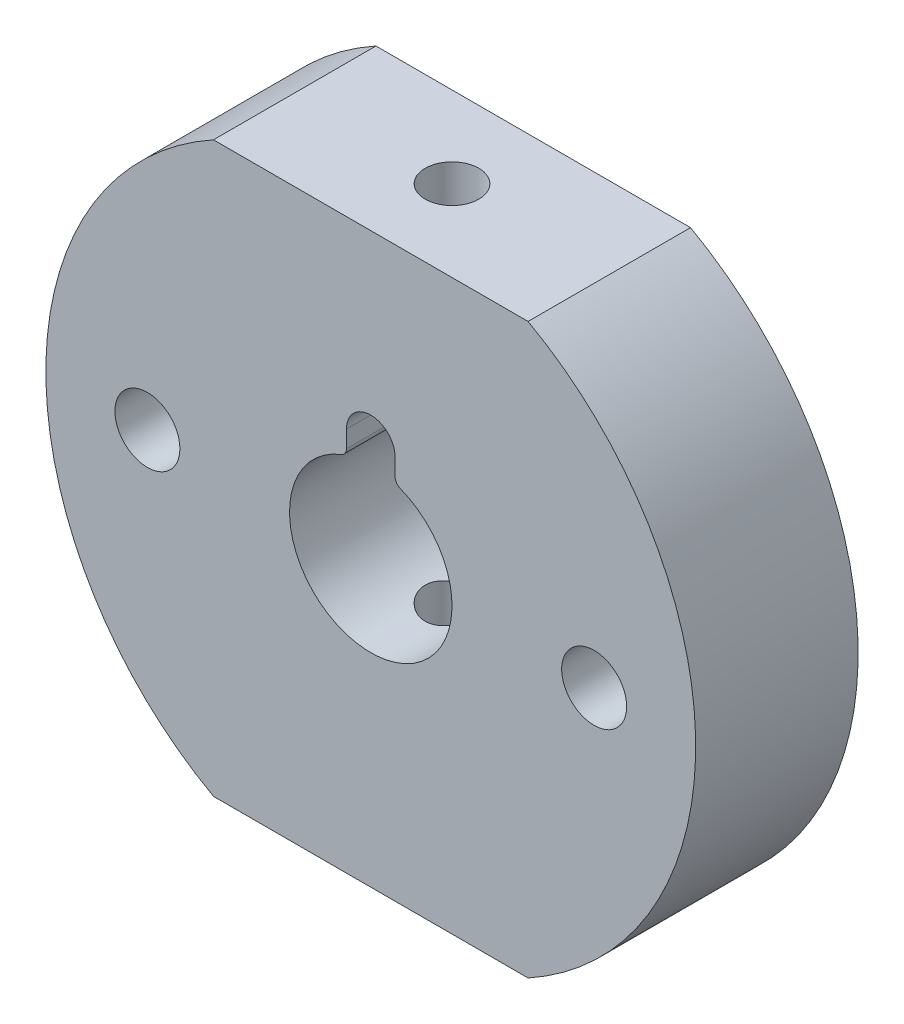
ISO-10303-21;
HEADER;
FILE_DESCRIPTION(('STEP AP214'),'2;1');
FILE_NAME('part.step','',(''),(''),'','','');
FILE_SCHEMA(('AUTOMOTIVE_DESIGN { 1 0 10303 214 1 1 1 1 }'));
ENDSEC;
DATA;
#1=APPLICATION_CONTEXT('core data for automotive mechanical design processes');
#2=APPLICATION_PROTOCOL_DEFINITION('international standard','automotive_design',2000,#1);
#3=PRODUCT_CONTEXT('',#1,'mechanical');
#4=PRODUCT('Part','Part','',(#3));
#5=PRODUCT_RELATED_PRODUCT_CATEGORY('part','',(#4));
#6=PRODUCT_DEFINITION_FORMATION('','',#4);
#7=PRODUCT_DEFINITION_CONTEXT('part definition',#1,'design');
#8=PRODUCT_DEFINITION('design','',#6,#7);
#9=PRODUCT_DEFINITION_SHAPE('','',#8);
#10=(LENGTH_UNIT() NAMED_UNIT(*) SI_UNIT(.MILLI.,.METRE.));
#11=(NAMED_UNIT(*) PLANE_ANGLE_UNIT() SI_UNIT($,.RADIAN.));
#12=(NAMED_UNIT(*) SI_UNIT($,.STERADIAN.) SOLID_ANGLE_UNIT());
#13=UNCERTAINTY_MEASURE_WITH_UNIT(LENGTH_MEASURE(1.E-05),#10,'distance_accuracy_value','');
#14=(GEOMETRIC_REPRESENTATION_CONTEXT(3) GLOBAL_UNCERTAINTY_ASSIGNED_CONTEXT((#13)) GLOBAL_UNIT_ASSIGNED_CONTEXT((#10,
#11,#12)) REPRESENTATION_CONTEXT('',''));
#15=CARTESIAN_POINT('',(0.,0.,0.));
#16=DIRECTION('',(0.,0.,1.));
#17=DIRECTION('',(1.,0.,0.));
#18=AXIS2_PLACEMENT_3D('',#15,#16,#17);
#19=CARTESIAN_POINT('',(0.,0.,10.));
#20=DIRECTION('',(0.,0.,1.));
#21=DIRECTION('',(1.,0.,0.));
#22=AXIS2_PLACEMENT_3D('',#19,#20,#21);
#23=PLANE('',#22);
#24=DIRECTION('',(1.,0.,0.));
#25=VECTOR('',#24,1.);
#26=CARTESIAN_POINT('',(0.,17.5,10.));
#27=LINE('',#26,#25);
#28=CARTESIAN_POINT('',(-9.68245836551854,17.5,10.));
#29=VERTEX_POINT('',#28);
#30=CARTESIAN_POINT('',(9.68245836551855,17.5,10.));
#31=VERTEX_POINT('',#30);
#32=EDGE_CURVE('E148',#29,#31,#27,.T.);
#33=ORIENTED_EDGE('',*,*,#32,.F.);
#34=CARTESIAN_POINT('',(0.,0.,10.));
#35=DIRECTION('',(0.,0.,1.));
#36=DIRECTION('',(1.,0.,0.));
#37=AXIS2_PLACEMENT_3D('',#34,#35,#36);
#38=CIRCLE('',#37,20.);
#39=CARTESIAN_POINT('',(-9.68245836551854,-17.5,10.));
#40=VERTEX_POINT('',#39);
#41=EDGE_CURVE('E157',#29,#40,#38,.T.);
#42=ORIENTED_EDGE('',*,*,#41,.T.);
#43=DIRECTION('',(1.,0.,0.));
#44=VECTOR('',#43,1.);
#45=CARTESIAN_POINT('',(0.,-17.5,10.));
#46=LINE('',#45,#44);
#47=CARTESIAN_POINT('',(9.68245836551855,-17.5,10.));
#48=VERTEX_POINT('',#47);
#49=EDGE_CURVE('E272',#40,#48,#46,.T.);
#50=ORIENTED_EDGE('',*,*,#49,.T.);
#51=EDGE_CURVE('E162',#48,#31,#38,.T.);
#52=ORIENTED_EDGE('',*,*,#51,.T.);
#53=EDGE_LOOP('',(#33,#42,#50,#52));
#54=FACE_BOUND('',#53,.T.);
#55=DIRECTION('',(0.,1.,0.));
#56=VECTOR('',#55,1.);
#57=CARTESIAN_POINT('',(1.5,0.,10.));
#58=LINE('',#57,#56);
#59=CARTESIAN_POINT('',(1.5,5.1234753829798,10.));
#60=VERTEX_POINT('',#59);
#61=CARTESIAN_POINT('',(1.5,6.16969600708473,10.));
#62=VERTEX_POINT('',#61);
#63=EDGE_CURVE('E284',#60,#62,#58,.T.);
#64=ORIENTED_EDGE('',*,*,#63,.F.);
#65=CARTESIAN_POINT('',(2.,5.1234753829798,10.));
#66=DIRECTION('',(0.,0.,1.));
#67=DIRECTION('',(1.,0.,0.));
#68=AXIS2_PLACEMENT_3D('',#65,#66,#67);
#69=CIRCLE('',#68,0.5);
#70=CARTESIAN_POINT('',(1.81818181818182,4.657704893618,10.));
#71=VERTEX_POINT('',#70);
#72=EDGE_CURVE('E349',#60,#71,#69,.T.);
#73=ORIENTED_EDGE('',*,*,#72,.T.);
#74=CARTESIAN_POINT('',(0.,0.,10.));
#75=DIRECTION('',(0.,0.,1.));
#76=DIRECTION('',(1.,0.,0.));
#77=AXIS2_PLACEMENT_3D('',#74,#75,#76);
#78=CIRCLE('',#77,5.);
#79=CARTESIAN_POINT('',(-1.81818181818182,4.657704893618,10.));
#80=VERTEX_POINT('',#79);
#81=EDGE_CURVE('E167',#80,#71,#78,.T.);
#82=ORIENTED_EDGE('',*,*,#81,.F.);
#83=CARTESIAN_POINT('',(-2.,5.1234753829798,10.));
#84=DIRECTION('',(0.,0.,1.));
#85=DIRECTION('',(1.,0.,0.));
#86=AXIS2_PLACEMENT_3D('',#83,#84,#85);
#87=CIRCLE('',#86,0.5);
#88=CARTESIAN_POINT('',(-1.5,5.1234753829798,10.));
#89=VERTEX_POINT('',#88);
#90=EDGE_CURVE('E350',#80,#89,#87,.T.);
#91=ORIENTED_EDGE('',*,*,#90,.T.);
#92=DIRECTION('',(0.,1.,0.));
#93=VECTOR('',#92,1.);
#94=CARTESIAN_POINT('',(-1.5,0.,10.));
#95=LINE('',#94,#93);
#96=CARTESIAN_POINT('',(-1.5,6.16969600708473,10.));
#97=VERTEX_POINT('',#96);
#98=EDGE_CURVE('E278',#89,#97,#95,.T.);
#99=ORIENTED_EDGE('',*,*,#98,.T.);
#100=CARTESIAN_POINT('',(0.,6.16969600708473,10.));
#101=DIRECTION('',(0.,0.,1.));
#102=DIRECTION('',(1.,0.,0.));
#103=AXIS2_PLACEMENT_3D('',#100,#101,#102);
#104=CIRCLE('',#103,1.5);
#105=EDGE_CURVE('E286',#62,#97,#104,.T.);
#106=ORIENTED_EDGE('',*,*,#105,.F.);
#107=EDGE_LOOP('',(#64,#73,#82,#91,#99,#106));
#108=FACE_BOUND('',#107,.T.);
#109=CARTESIAN_POINT('',(-13.75,0.,10.));
#110=DIRECTION('',(0.,0.,1.));
#111=DIRECTION('',(1.,0.,0.));
#112=AXIS2_PLACEMENT_3D('',#109,#110,#111);
#113=CIRCLE('',#112,2.);
#114=CARTESIAN_POINT('',(-11.75,0.,10.));
#115=VERTEX_POINT('',#114);
#116=EDGE_CURVE('E302',#115,#115,#113,.T.);
#117=ORIENTED_EDGE('',*,*,#116,.F.);
#118=EDGE_LOOP('',(#117));
#119=FACE_BOUND('',#118,.T.);
#120=CARTESIAN_POINT('',(13.75,0.,10.));
#121=DIRECTION('',(0.,0.,1.));
#122=DIRECTION('',(1.,0.,0.));
#123=AXIS2_PLACEMENT_3D('',#120,#121,#122);
#124=CIRCLE('',#123,2.);
#125=CARTESIAN_POINT('',(15.75,0.,10.));
#126=VERTEX_POINT('',#125);
#127=EDGE_CURVE('E296',#126,#126,#124,.T.);
#128=ORIENTED_EDGE('',*,*,#127,.F.);
#129=EDGE_LOOP('',(#128));
#130=FACE_BOUND('',#129,.T.);
#131=ADVANCED_FACE('F35',(#54,#108,#119,#130),#23,.T.);
#132=CARTESIAN_POINT('',(0.,0.,0.));
#133=DIRECTION('',(0.,0.,1.));
#134=DIRECTION('',(1.,0.,0.));
#135=AXIS2_PLACEMENT_3D('',#132,#133,#134);
#136=PLANE('',#135);
#137=CARTESIAN_POINT('',(13.75,0.,0.));
#138=DIRECTION('',(0.,0.,1.));
#139=DIRECTION('',(1.,0.,0.));
#140=AXIS2_PLACEMENT_3D('',#137,#138,#139);
#141=CIRCLE('',#140,2.);
#142=CARTESIAN_POINT('',(15.75,0.,0.));
#143=VERTEX_POINT('',#142);
#144=EDGE_CURVE('E178',#143,#143,#141,.T.);
#145=ORIENTED_EDGE('',*,*,#144,.T.);
#146=EDGE_LOOP('',(#145));
#147=FACE_BOUND('',#146,.T.);
#148=CARTESIAN_POINT('',(-13.75,0.,0.));
#149=DIRECTION('',(0.,0.,1.));
#150=DIRECTION('',(1.,0.,0.));
#151=AXIS2_PLACEMENT_3D('',#148,#149,#150);
#152=CIRCLE('',#151,2.);
#153=CARTESIAN_POINT('',(-11.75,0.,0.));
#154=VERTEX_POINT('',#153);
#155=EDGE_CURVE('E299',#154,#154,#152,.T.);
#156=ORIENTED_EDGE('',*,*,#155,.T.);
#157=EDGE_LOOP('',(#156));
#158=FACE_BOUND('',#157,.T.);
#159=CARTESIAN_POINT('',(0.,0.,0.));
#160=DIRECTION('',(0.,0.,1.));
#161=DIRECTION('',(1.,0.,0.));
#162=AXIS2_PLACEMENT_3D('',#159,#160,#161);
#163=CIRCLE('',#162,5.);
#164=CARTESIAN_POINT('',(-1.81818181818182,4.657704893618,0.));
#165=VERTEX_POINT('',#164);
#166=CARTESIAN_POINT('',(1.81818181818182,4.657704893618,0.));
#167=VERTEX_POINT('',#166);
#168=EDGE_CURVE('E305',#165,#167,#163,.T.);
#169=ORIENTED_EDGE('',*,*,#168,.T.);
#170=CARTESIAN_POINT('',(2.,5.1234753829798,0.));
#171=DIRECTION('',(0.,0.,1.));
#172=DIRECTION('',(1.,0.,0.));
#173=AXIS2_PLACEMENT_3D('',#170,#171,#172);
#174=CIRCLE('',#173,0.5);
#175=CARTESIAN_POINT('',(1.5,5.1234753829798,0.));
#176=VERTEX_POINT('',#175);
#177=EDGE_CURVE('E313',#167,#176,#174,.F.);
#178=ORIENTED_EDGE('',*,*,#177,.T.);
#179=DIRECTION('',(0.,1.,0.));
#180=VECTOR('',#179,1.);
#181=CARTESIAN_POINT('',(1.5,0.,0.));
#182=LINE('',#181,#180);
#183=CARTESIAN_POINT('',(1.5,6.16969600708473,0.));
#184=VERTEX_POINT('',#183);
#185=EDGE_CURVE('E275',#176,#184,#182,.T.);
#186=ORIENTED_EDGE('',*,*,#185,.T.);
#187=CARTESIAN_POINT('',(0.,6.16969600708473,0.));
#188=DIRECTION('',(0.,0.,1.));
#189=DIRECTION('',(1.,0.,0.));
#190=AXIS2_PLACEMENT_3D('',#187,#188,#189);
#191=CIRCLE('',#190,1.5);
#192=CARTESIAN_POINT('',(-1.5,6.16969600708473,0.));
#193=VERTEX_POINT('',#192);
#194=EDGE_CURVE('E277',#184,#193,#191,.T.);
#195=ORIENTED_EDGE('',*,*,#194,.T.);
#196=DIRECTION('',(0.,1.,0.));
#197=VECTOR('',#196,1.);
#198=CARTESIAN_POINT('',(-1.5,0.,0.));
#199=LINE('',#198,#197);
#200=CARTESIAN_POINT('',(-1.5,5.1234753829798,0.));
#201=VERTEX_POINT('',#200);
#202=EDGE_CURVE('E281',#201,#193,#199,.T.);
#203=ORIENTED_EDGE('',*,*,#202,.F.);
#204=CARTESIAN_POINT('',(-2.,5.1234753829798,0.));
#205=DIRECTION('',(0.,0.,1.));
#206=DIRECTION('',(1.,0.,0.));
#207=AXIS2_PLACEMENT_3D('',#204,#205,#206);
#208=CIRCLE('',#207,0.5);
#209=EDGE_CURVE('E317',#201,#165,#208,.F.);
#210=ORIENTED_EDGE('',*,*,#209,.T.);
#211=EDGE_LOOP('',(#169,#178,#186,#195,#203,#210));
#212=FACE_BOUND('',#211,.T.);
#213=CARTESIAN_POINT('',(0.,0.,0.));
#214=DIRECTION('',(0.,0.,1.));
#215=DIRECTION('',(1.,0.,0.));
#216=AXIS2_PLACEMENT_3D('',#213,#214,#215);
#217=CIRCLE('',#216,20.);
#218=CARTESIAN_POINT('',(-9.68245836551854,17.5,0.));
#219=VERTEX_POINT('',#218);
#220=CARTESIAN_POINT('',(-9.68245836551854,-17.5,0.));
#221=VERTEX_POINT('',#220);
#222=EDGE_CURVE('E155',#219,#221,#217,.T.);
#223=ORIENTED_EDGE('',*,*,#222,.F.);
#224=DIRECTION('',(1.,0.,0.));
#225=VECTOR('',#224,1.);
#226=CARTESIAN_POINT('',(0.,17.5,0.));
#227=LINE('',#226,#225);
#228=CARTESIAN_POINT('',(9.68245836551855,17.5,0.));
#229=VERTEX_POINT('',#228);
#230=EDGE_CURVE('E136',#219,#229,#227,.T.);
#231=ORIENTED_EDGE('',*,*,#230,.T.);
#232=CARTESIAN_POINT('',(9.68245836551855,-17.5,0.));
#233=VERTEX_POINT('',#232);
#234=EDGE_CURVE('E163',#233,#229,#217,.T.);
#235=ORIENTED_EDGE('',*,*,#234,.F.);
#236=DIRECTION('',(1.,0.,0.));
#237=VECTOR('',#236,1.);
#238=CARTESIAN_POINT('',(0.,-17.5,0.));
#239=LINE('',#238,#237);
#240=EDGE_CURVE('E161',#221,#233,#239,.T.);
#241=ORIENTED_EDGE('',*,*,#240,.F.);
#242=EDGE_LOOP('',(#223,#231,#235,#241));
#243=FACE_BOUND('',#242,.T.);
#244=ADVANCED_FACE('F160',(#147,#158,#212,#243),#136,.F.);
#245=CARTESIAN_POINT('',(0.,0.,10.));
#246=DIRECTION('',(0.,0.,-1.));
#247=DIRECTION('',(-1.,0.,0.));
#248=AXIS2_PLACEMENT_3D('',#245,#246,#247);
#249=CYLINDRICAL_SURFACE('',#248,20.);
#250=ORIENTED_EDGE('',*,*,#41,.F.);
#251=DIRECTION('',(0.,0.,1.));
#252=VECTOR('',#251,1.);
#253=CARTESIAN_POINT('',(-9.68245836551854,17.5,0.));
#254=LINE('',#253,#252);
#255=EDGE_CURVE('E140',#219,#29,#254,.T.);
#256=ORIENTED_EDGE('',*,*,#255,.F.);
#257=ORIENTED_EDGE('',*,*,#222,.T.);
#258=DIRECTION('',(0.,0.,1.));
#259=VECTOR('',#258,1.);
#260=CARTESIAN_POINT('',(-9.68245836551854,-17.5,0.));
#261=LINE('',#260,#259);
#262=EDGE_CURVE('E267',#221,#40,#261,.T.);
#263=ORIENTED_EDGE('',*,*,#262,.T.);
#264=EDGE_LOOP('',(#250,#256,#257,#263));
#265=FACE_BOUND('',#264,.T.);
#266=ADVANCED_FACE('F153',(#265),#249,.T.);
#267=ORIENTED_EDGE('',*,*,#234,.T.);
#268=DIRECTION('',(0.,0.,1.));
#269=VECTOR('',#268,1.);
#270=CARTESIAN_POINT('',(9.68245836551855,17.5,0.));
#271=LINE('',#270,#269);
#272=EDGE_CURVE('E143',#229,#31,#271,.T.);
#273=ORIENTED_EDGE('',*,*,#272,.T.);
#274=ORIENTED_EDGE('',*,*,#51,.F.);
#275=DIRECTION('',(0.,0.,1.));
#276=VECTOR('',#275,1.);
#277=CARTESIAN_POINT('',(9.68245836551855,-17.5,0.));
#278=LINE('',#277,#276);
#279=EDGE_CURVE('E265',#233,#48,#278,.T.);
#280=ORIENTED_EDGE('',*,*,#279,.F.);
#281=EDGE_LOOP('',(#267,#273,#274,#280));
#282=FACE_BOUND('',#281,.T.);
#283=ADVANCED_FACE('F196',(#282),#249,.T.);
#284=CARTESIAN_POINT('',(0.,-20.,5.));
#285=DIRECTION('',(0.,1.,0.));
#286=DIRECTION('',(0.,0.,1.));
#287=AXIS2_PLACEMENT_3D('',#284,#285,#286);
#288=CYLINDRICAL_SURFACE('',#287,1.65);
#289=CARTESIAN_POINT('',(0.,-5.,6.65));
#290=CARTESIAN_POINT('',(0.0900803323989869,-5.00000012564882,6.65000024251439));
#291=CARTESIAN_POINT('',(0.180159574077353,-4.99754312617873,6.64259916251505));
#292=CARTESIAN_POINT('',(0.357667875169258,-4.98798348171152,6.61327885047237));
#293=CARTESIAN_POINT('',(0.445096605656321,-4.98088026257134,6.59135782416472));
#294=CARTESIAN_POINT('',(0.614719075952395,-4.962800681432,6.53382868761172));
#295=CARTESIAN_POINT('',(0.696921201899967,-4.95183071876684,6.49824318298597));
#296=CARTESIAN_POINT('',(0.854190645874484,-4.92713947248839,6.41449642730815));
#297=CARTESIAN_POINT('',(0.929256597076055,-4.91341766335966,6.36633277369658));
#298=CARTESIAN_POINT('',(1.07267700256014,-4.88414667976014,6.25707517692859));
#299=CARTESIAN_POINT('',(1.140755021368,-4.86855436886587,6.19562998172584));
#300=CARTESIAN_POINT('',(1.26585047260417,-4.83753907804007,6.06230048608017));
#301=CARTESIAN_POINT('',(1.32286553369749,-4.8221161350793,5.99041395330729));
#302=CARTESIAN_POINT('',(1.42578155512387,-4.79271313173333,5.83576938762055));
#303=CARTESIAN_POINT('',(1.47132547146369,-4.77878574898835,5.75276276241484));
#304=CARTESIAN_POINT('',(1.54768950007051,-4.75460549483772,5.57973436916592));
#305=CARTESIAN_POINT('',(1.57851400356116,-4.74435152777496,5.48971470264767));
#306=CARTESIAN_POINT('',(1.62353134991424,-4.72913282635101,5.30835517091874));
#307=CARTESIAN_POINT('',(1.6382413417332,-4.72400412235766,5.21715783667435));
#308=CARTESIAN_POINT('',(1.65222861163856,-4.7191313464795,5.03345638730599));
#309=CARTESIAN_POINT('',(1.65151054662635,-4.71938564975367,4.94095267493226));
#310=CARTESIAN_POINT('',(1.63506410098719,-4.72510629107568,4.76165279760769));
#311=CARTESIAN_POINT('',(1.62000769651633,-4.73033928879681,4.67478626476119));
#312=CARTESIAN_POINT('',(1.57640708934977,-4.74504632523487,4.50488909383327));
#313=CARTESIAN_POINT('',(1.54786130181506,-4.75452086227438,4.42185890773474));
#314=CARTESIAN_POINT('',(1.47764674240873,-4.77681173941,4.26045256000536));
#315=CARTESIAN_POINT('',(1.43577693123636,-4.78967871947683,4.18217114977468));
#316=CARTESIAN_POINT('',(1.34024242388315,-4.81728315916032,4.03353163769848));
#317=CARTESIAN_POINT('',(1.28657437554158,-4.8320211498719,3.96317579630594));
#318=CARTESIAN_POINT('',(1.16572801734404,-4.86262798242566,3.82860477258979));
#319=CARTESIAN_POINT('',(1.09799945388895,-4.87851612594017,3.76488712135686));
#320=CARTESIAN_POINT('',(0.952622363558089,-4.9089733458653,3.6495858217608));
#321=CARTESIAN_POINT('',(0.874972923819722,-4.92354230068063,3.59800329124501));
#322=CARTESIAN_POINT('',(0.710918878360197,-4.94990429259939,3.50804648316298));
#323=CARTESIAN_POINT('',(0.624437715003009,-4.96166947936115,3.46980310278695));
#324=CARTESIAN_POINT('',(0.445788820584338,-4.98089634514734,3.4085602803937));
#325=CARTESIAN_POINT('',(0.353623035566636,-4.98835948795835,3.38555565293587));
#326=CARTESIAN_POINT('',(0.170434936942811,-4.99790001929539,3.35631921461674));
#327=CARTESIAN_POINT('',(0.0795310449403325,-5.00019320840939,3.34941490636054));
#328=CARTESIAN_POINT('',(-0.10215299707419,-4.99978120399321,3.35066263269126));
#329=CARTESIAN_POINT('',(-0.19293316503069,-4.99707683523427,3.35881218286676));
#330=CARTESIAN_POINT('',(-0.369117276094977,-4.98711592890817,3.38940282618291));
#331=CARTESIAN_POINT('',(-0.454600657078434,-4.97999029806495,3.41143321001453));
#332=CARTESIAN_POINT('',(-0.620625393385988,-4.9620361021664,3.46864869151175));
#333=CARTESIAN_POINT('',(-0.701166119538833,-4.9512070668376,3.50383545988189));
#334=CARTESIAN_POINT('',(-0.857353583850657,-4.92659738190256,3.58738101955236));
#335=CARTESIAN_POINT('',(-0.93281853863681,-4.91274728599483,3.63605861476449));
#336=CARTESIAN_POINT('',(-1.07472879779133,-4.8836680633903,3.74482823479591));
#337=CARTESIAN_POINT('',(-1.14117138619964,-4.86843852373584,3.80492368367396));
#338=CARTESIAN_POINT('',(-1.26622547851877,-4.83745909847491,3.93798617269195));
#339=CARTESIAN_POINT('',(-1.32435715949936,-4.82171620160002,4.0114068669237));
#340=CARTESIAN_POINT('',(-1.42753142742357,-4.79218567046632,4.16729985489368));
#341=CARTESIAN_POINT('',(-1.47257396443646,-4.77839804366632,4.24977218315924));
#342=CARTESIAN_POINT('',(-1.54806908435208,-4.75447746870333,4.42142548395833));
#343=CARTESIAN_POINT('',(-1.57855621066785,-4.74433588191365,4.51058998597721));
#344=CARTESIAN_POINT('',(-1.62395003915296,-4.728992662468,4.69319790207959));
#345=CARTESIAN_POINT('',(-1.6388635764124,-4.72378886275909,4.78663942021202));
#346=CARTESIAN_POINT('',(-1.65216049477084,-4.71915352744857,4.97008542491291));
#347=CARTESIAN_POINT('',(-1.65133872365081,-4.71944442417866,5.06002593637817));
#348=CARTESIAN_POINT('',(-1.63513842564514,-4.72508139490563,5.23841659959015));
#349=CARTESIAN_POINT('',(-1.61976073262756,-4.73042717932209,5.32686683641512));
#350=CARTESIAN_POINT('',(-1.57544291875232,-4.74536693764461,5.49816413718459));
#351=CARTESIAN_POINT('',(-1.5467552709297,-4.75488165289364,5.58108397215747));
#352=CARTESIAN_POINT('',(-1.47683540940046,-4.77705935615133,5.74099749266258));
#353=CARTESIAN_POINT('',(-1.43560044678477,-4.78972303393433,5.81798987495191));
#354=CARTESIAN_POINT('',(-1.33969084183066,-4.81744939348764,5.96744345436639));
#355=CARTESIAN_POINT('',(-1.28451538865982,-4.83259170443489,6.03956841106977));
#356=CARTESIAN_POINT('',(-1.16314331347536,-4.86323043063064,6.17379258067502));
#357=CARTESIAN_POINT('',(-1.09694360376003,-4.87872694403302,6.23588897512674));
#358=CARTESIAN_POINT('',(-0.95238767673411,-4.90903317548773,6.35066333180926));
#359=CARTESIAN_POINT('',(-0.873665758138173,-4.92379458911327,6.40289502168525));
#360=CARTESIAN_POINT('',(-0.70807708205127,-4.95031750248797,6.49332485789776));
#361=CARTESIAN_POINT('',(-0.621212604024481,-4.96207983840249,6.53152691711137));
#362=CARTESIAN_POINT('',(-0.446386541872214,-4.98076953032462,6.59101301503053));
#363=CARTESIAN_POINT('',(-0.358709155083953,-4.98791371763214,6.61306352248398));
#364=CARTESIAN_POINT('',(-0.180687007883428,-4.99752827480817,6.6425549720432));
#365=CARTESIAN_POINT('',(-0.0903429553968477,-4.99999987398486,6.64999975677857));
#366=CARTESIAN_POINT('',(0.,-5.,6.65));
#367=B_SPLINE_CURVE_WITH_KNOTS('',3,(#289,#290,#291,#292,#293,#294,#295,#296,#297,#298,#299,
#300,#301,#302,#303,#304,#305,#306,#307,#308,#309,#310,#311,#312,#313,#314,#315,#316,#317,#318,
#319,#320,#321,#322,#323,#324,#325,#326,#327,#328,#329,#330,#331,#332,#333,#334,#335,#336,#337,
#338,#339,#340,#341,#342,#343,#344,#345,#346,#347,#348,#349,#350,#351,#352,#353,#354,#355,#356,
#357,#358,#359,#360,#361,#362,#363,#364,#365,#366),.UNSPECIFIED.,.T.,.F.,(4,2,2,2,2,2,2,2,2,2,2,
2,2,2,2,2,2,2,2,2,2,2,2,2,2,2,2,2,2,2,2,2,2,2,2,2,2,2,4),(0.,0.2699086041325,0.539850567737247,
0.809347867689094,1.07889668217443,1.35671215765951,1.63458711701568,1.92026489148117,
2.20585738673402,2.48198869358467,2.75803665240173,3.02175295330504,3.28550024538373,
3.55343249441287,3.82144096800204,4.10314526837295,4.38487550826387,4.66929734218009,
4.95362234329175,5.22584041060146,5.49801355645393,5.76248915124948,6.02699834271655,
6.29838751507405,6.56985820217368,6.85340472718154,7.13695233381086,7.41982362841787,
7.70257072144072,7.9710746862461,8.23956327014096,8.50315503612411,8.76680459233092,
9.04176838412562,9.31680931840238,9.60227659952698,9.88766420298746,10.1584309528124,
10.4291264568694),.UNSPECIFIED.);
#368=CARTESIAN_POINT('',(0.,-5.,6.65));
#369=VERTEX_POINT('',#368);
#370=EDGE_CURVE('E170',#369,#369,#367,.T.);
#371=ORIENTED_EDGE('',*,*,#370,.T.);
#372=EDGE_LOOP('',(#371));
#373=FACE_BOUND('',#372,.T.);
#374=CARTESIAN_POINT('',(0.,-17.5,5.));
#375=DIRECTION('',(0.,-1.,0.));
#376=DIRECTION('',(1.,0.,0.));
#377=AXIS2_PLACEMENT_3D('',#374,#375,#376);
#378=CIRCLE('',#377,1.65);
#379=CARTESIAN_POINT('',(1.65,-17.5,5.));
#380=VERTEX_POINT('',#379);
#381=EDGE_CURVE('E366',#380,#380,#378,.F.);
#382=ORIENTED_EDGE('',*,*,#381,.F.);
#383=EDGE_LOOP('',(#382));
#384=FACE_BOUND('',#383,.T.);
#385=ADVANCED_FACE('F191',(#373,#384),#288,.F.);
#386=CARTESIAN_POINT('',(0.,0.,10.));
#387=DIRECTION('',(0.,0.,-1.));
#388=DIRECTION('',(-1.,0.,0.));
#389=AXIS2_PLACEMENT_3D('',#386,#387,#388);
#390=CYLINDRICAL_SURFACE('',#389,5.);
#391=ORIENTED_EDGE('',*,*,#81,.T.);
#392=DIRECTION('',(0.,0.,-1.));
#393=VECTOR('',#392,1.);
#394=CARTESIAN_POINT('',(1.81818181818182,4.657704893618,10.));
#395=LINE('',#394,#393);
#396=EDGE_CURVE('E323',#71,#167,#395,.T.);
#397=ORIENTED_EDGE('',*,*,#396,.T.);
#398=ORIENTED_EDGE('',*,*,#168,.F.);
#399=DIRECTION('',(0.,0.,-1.));
#400=VECTOR('',#399,1.);
#401=CARTESIAN_POINT('',(-1.81818181818182,4.657704893618,10.));
#402=LINE('',#401,#400);
#403=EDGE_CURVE('E357',#165,#80,#402,.F.);
#404=ORIENTED_EDGE('',*,*,#403,.T.);
#405=EDGE_LOOP('',(#391,#397,#398,#404));
#406=FACE_BOUND('',#405,.T.);
#407=ORIENTED_EDGE('',*,*,#370,.F.);
#408=EDGE_LOOP('',(#407));
#409=FACE_BOUND('',#408,.T.);
#410=ADVANCED_FACE('F187',(#406,#409),#390,.F.);
#411=CARTESIAN_POINT('',(-13.75,0.,10.));
#412=DIRECTION('',(0.,0.,-1.));
#413=DIRECTION('',(-1.,0.,0.));
#414=AXIS2_PLACEMENT_3D('',#411,#412,#413);
#415=CYLINDRICAL_SURFACE('',#414,2.);
#416=ORIENTED_EDGE('',*,*,#116,.T.);
#417=EDGE_LOOP('',(#416));
#418=FACE_BOUND('',#417,.T.);
#419=ORIENTED_EDGE('',*,*,#155,.F.);
#420=EDGE_LOOP('',(#419));
#421=FACE_BOUND('',#420,.T.);
#422=ADVANCED_FACE('F378',(#418,#421),#415,.F.);
#423=CARTESIAN_POINT('',(13.75,0.,10.));
#424=DIRECTION('',(0.,0.,-1.));
#425=DIRECTION('',(-1.,0.,0.));
#426=AXIS2_PLACEMENT_3D('',#423,#424,#425);
#427=CYLINDRICAL_SURFACE('',#426,2.);
#428=ORIENTED_EDGE('',*,*,#127,.T.);
#429=EDGE_LOOP('',(#428));
#430=FACE_BOUND('',#429,.T.);
#431=ORIENTED_EDGE('',*,*,#144,.F.);
#432=EDGE_LOOP('',(#431));
#433=FACE_BOUND('',#432,.T.);
#434=ADVANCED_FACE('F200',(#430,#433),#427,.F.);
#435=CARTESIAN_POINT('',(0.,17.5,5.));
#436=DIRECTION('',(0.,-1.,0.));
#437=DIRECTION('',(1.,0.,0.));
#438=AXIS2_PLACEMENT_3D('',#435,#436,#437);
#439=CIRCLE('',#438,1.65);
#440=CARTESIAN_POINT('',(1.65,17.5,5.));
#441=VERTEX_POINT('',#440);
#442=EDGE_CURVE('E287',#441,#441,#439,.F.);
#443=ORIENTED_EDGE('',*,*,#442,.T.);
#444=EDGE_LOOP('',(#443));
#445=FACE_BOUND('',#444,.T.);
#446=DIRECTION('',(0.,1.,0.));
#447=VECTOR('',#446,1.);
#448=CARTESIAN_POINT('',(1.5,-20.,4.31261364575662));
#449=LINE('',#448,#447);
#450=CARTESIAN_POINT('',(1.5,6.16969600708473,4.31261364575662));
#451=VERTEX_POINT('',#450);
#452=CARTESIAN_POINT('',(1.5,5.1234753829798,4.31261364575662));
#453=VERTEX_POINT('',#452);
#454=EDGE_CURVE('E339',#451,#453,#449,.F.);
#455=ORIENTED_EDGE('',*,*,#454,.T.);
#456=CARTESIAN_POINT('',(1.5,5.1234753829798,4.31261364575662));
#457=CARTESIAN_POINT('',(1.49998522536645,5.11103341300865,4.31259073877459));
#458=CARTESIAN_POINT('',(1.50046373284753,5.09861881657721,4.31362536115257));
#459=CARTESIAN_POINT('',(1.50228314632314,5.07426248720778,4.31761201204794));
#460=CARTESIAN_POINT('',(1.50361726572787,5.06231781137854,4.3205489534572));
#461=CARTESIAN_POINT('',(1.50702311654809,5.03914226515855,4.32813890837247));
#462=CARTESIAN_POINT('',(1.50909307154573,5.02790975179097,4.33278778995941));
#463=CARTESIAN_POINT('',(1.51380278016137,5.00627944662721,4.34354281076478));
#464=CARTESIAN_POINT('',(1.51644367626189,4.9958833867007,4.34965187450916));
#465=CARTESIAN_POINT('',(1.52369475253232,4.97053464017675,4.36676978610168));
#466=CARTESIAN_POINT('',(1.52858753820995,4.9562325707897,4.37862235038721));
#467=CARTESIAN_POINT('',(1.5388103648931,4.92981193081142,4.40438540913667));
#468=CARTESIAN_POINT('',(1.54414143539981,4.91769872803177,4.41830081436571));
#469=CARTESIAN_POINT('',(1.55802580906413,4.88885272260774,4.45624851700907));
#470=CARTESIAN_POINT('',(1.5666210827641,4.87362167891856,4.4813988380012));
#471=CARTESIAN_POINT('',(1.58304142537722,4.84709135719752,4.53390520852475));
#472=CARTESIAN_POINT('',(1.59086463077873,4.8358014328704,4.56126631823678));
#473=CARTESIAN_POINT('',(1.60417467296178,4.81781796111288,4.61305622225984));
#474=CARTESIAN_POINT('',(1.6098358242443,4.81068513947466,4.63729166034758));
#475=CARTESIAN_POINT('',(1.62012941142595,4.79826369781921,4.68645056426332));
#476=CARTESIAN_POINT('',(1.62476114786719,4.79297633035215,4.71137448504568));
#477=CARTESIAN_POINT('',(1.63697073183077,4.77943506458776,4.7868803075035));
#478=CARTESIAN_POINT('',(1.64285570960046,4.77351072720283,4.8381685202911));
#479=CARTESIAN_POINT('',(1.64998440866804,4.76638659563719,4.94454060561032));
#480=CARTESIAN_POINT('',(1.65091890364457,4.76550132391685,4.99966320556164));
#481=CARTESIAN_POINT('',(1.64727355453214,4.76908284502517,5.10954542757168));
#482=CARTESIAN_POINT('',(1.64269820419465,4.77354527632886,5.16430530885279));
#483=CARTESIAN_POINT('',(1.63015372487818,4.78691764736868,5.25834269559992));
#484=CARTESIAN_POINT('',(1.6233580831951,4.79439090736225,5.29798434343186));
#485=CARTESIAN_POINT('',(1.60716495708209,4.81388529979318,5.37560375727967));
#486=CARTESIAN_POINT('',(1.5977717826068,4.8258989106603,5.413584159849));
#487=CARTESIAN_POINT('',(1.5810036335653,4.85040202272173,5.47274764845049));
#488=CARTESIAN_POINT('',(1.57420097941324,4.86100813458205,5.49486955424992));
#489=CARTESIAN_POINT('',(1.56021529180148,4.8851784098979,5.53732938605524));
#490=CARTESIAN_POINT('',(1.55303280495819,4.8987384056671,5.55766976951651));
#491=CARTESIAN_POINT('',(1.54101455862984,4.9248020599481,5.58989549510515));
#492=CARTESIAN_POINT('',(1.53612155242689,4.93640096635159,5.60248605080243));
#493=CARTESIAN_POINT('',(1.52677026614546,4.96151074964652,5.62580288605625));
#494=CARTESIAN_POINT('',(1.52231138686423,4.97501892623033,5.63653175168861));
#495=CARTESIAN_POINT('',(1.51520976787454,5.00055194101051,5.65322427025812));
#496=CARTESIAN_POINT('',(1.51238646996378,5.01217949674876,5.65971525352647));
#497=CARTESIAN_POINT('',(1.50748233561361,5.03642096091192,5.67084567976375));
#498=CARTESIAN_POINT('',(1.50539964449654,5.04903230758697,5.67548975139961));
#499=CARTESIAN_POINT('',(1.5025636769065,5.07193097662877,5.6817711470073));
#500=CARTESIAN_POINT('',(1.50161331194908,5.08207111636082,5.68385786555456));
#501=CARTESIAN_POINT('',(1.50032625321113,5.10262701544989,5.68667445060585));
#502=CARTESIAN_POINT('',(1.49999268949077,5.11304390997112,5.68739739679235));
#503=CARTESIAN_POINT('',(1.5,5.1234753829798,5.68738635424338));
#504=B_SPLINE_CURVE_WITH_KNOTS('',3,(#456,#457,#458,#459,#460,#461,#462,#463,#464,#465,#466,
#467,#468,#469,#470,#471,#472,#473,#474,#475,#476,#477,#478,#479,#480,#481,#482,#483,#484,#485,
#486,#487,#488,#489,#490,#491,#492,#493,#494,#495,#496,#497,#498,#499,#500,#501,#502,#503),
.UNSPECIFIED.,.F.,.F.,(4,2,2,2,2,2,2,2,2,2,2,2,2,2,2,2,2,2,2,2,2,2,2,4),(0.,0.0372302967811126,
0.0741688803542122,0.111018887561281,0.147943327551868,0.205240205754995,0.262675742043486,
0.35406178472305,0.445663268081121,0.523224430935422,0.600838134347181,0.756154469462723,
0.92106705492919,1.08584523107899,1.2083015499722,1.33055588999485,1.40676529334273,
1.48286786001989,1.53612618501821,1.58930992603615,1.62999682235681,1.67058109809064,
1.70166346732426,1.73290314083585),.UNSPECIFIED.);
#505=CARTESIAN_POINT('',(1.5,5.1234753829798,5.68738635424338));
#506=VERTEX_POINT('',#505);
#507=EDGE_CURVE('E204',#453,#506,#504,.T.);
#508=ORIENTED_EDGE('',*,*,#507,.T.);
#509=DIRECTION('',(0.,1.,0.));
#510=VECTOR('',#509,1.);
#511=CARTESIAN_POINT('',(1.5,-20.,5.68738635424338));
#512=LINE('',#511,#510);
#513=CARTESIAN_POINT('',(1.5,6.16969600708473,5.68738635424338));
#514=VERTEX_POINT('',#513);
#515=EDGE_CURVE('E222',#506,#514,#512,.T.);
#516=ORIENTED_EDGE('',*,*,#515,.T.);
#517=CARTESIAN_POINT('',(1.5,6.16969600708473,5.68738635424338));
#518=CARTESIAN_POINT('',(1.50000447406715,6.19184445208462,5.68736667555057));
#519=CARTESIAN_POINT('',(1.49950927634109,6.21397214122609,5.6884578365794));
#520=CARTESIAN_POINT('',(1.49756294449903,6.25792694784077,5.69268592309486));
#521=CARTESIAN_POINT('',(1.49611456325326,6.2797547466415,5.69581695700506));
#522=CARTESIAN_POINT('',(1.49047328028752,6.34376115294794,5.70786105987619));
#523=CARTESIAN_POINT('',(1.48498052511108,6.38532753020307,5.71943896893516));
#524=CARTESIAN_POINT('',(1.46744293306414,6.48664944579924,5.75475466598342));
#525=CARTESIAN_POINT('',(1.45348605708138,6.54489174419396,5.78168225412288));
#526=CARTESIAN_POINT('',(1.41979888355067,6.6571903569618,5.84135011584659));
#527=CARTESIAN_POINT('',(1.40000270816456,6.71118947854763,5.87415493945667));
#528=CARTESIAN_POINT('',(1.35783883670071,6.80903230580565,5.93811779345332));
#529=CARTESIAN_POINT('',(1.33606556934905,6.85331677428346,5.96900038503548));
#530=CARTESIAN_POINT('',(1.28850839632404,6.93921373967065,6.03140245086513));
#531=CARTESIAN_POINT('',(1.26272187201678,6.98082446674906,6.06292232917221));
#532=CARTESIAN_POINT('',(1.17948671828246,7.10155150823488,6.15683575303896));
#533=CARTESIAN_POINT('',(1.11598629807275,7.17696867462346,6.21886856717085));
#534=CARTESIAN_POINT('',(0.990098916855099,7.29901525400758,6.32178319800018));
#535=CARTESIAN_POINT('',(0.931303964781115,7.34815609013379,6.36410696518008));
#536=CARTESIAN_POINT('',(0.804150695646662,7.43831523772511,6.44270567343807));
#537=CARTESIAN_POINT('',(0.735805408924678,7.47934443542861,6.47898871101306));
#538=CARTESIAN_POINT('',(0.60468801219246,7.54395123864682,6.53652554955184));
#539=CARTESIAN_POINT('',(0.54351492666285,7.56937699366606,6.55933336587965));
#540=CARTESIAN_POINT('',(0.416346887973418,7.61231432043548,6.59798595778392));
#541=CARTESIAN_POINT('',(0.350355158091529,7.62983112729291,6.6138353391095));
#542=CARTESIAN_POINT('',(0.214726616012648,7.65586072109593,6.63742329587386));
#543=CARTESIAN_POINT('',(0.145069469232835,7.66431612099173,6.64511017436952));
#544=CARTESIAN_POINT('',(0.00485236427367641,7.67132745948093,6.65148252854544));
#545=CARTESIAN_POINT('',(-0.0657072514139839,7.66988704847324,6.65017132346822));
#546=CARTESIAN_POINT('',(-0.198055856544784,7.65789544406017,6.63927808616108));
#547=CARTESIAN_POINT('',(-0.260006547660201,7.64828652425434,6.63055149319627));
#548=CARTESIAN_POINT('',(-0.381012828513429,7.62182112951834,6.60659140763457));
#549=CARTESIAN_POINT('',(-0.440067859663012,7.6049632623074,6.59135666504311));
#550=CARTESIAN_POINT('',(-0.55698550315074,7.56389759751629,6.55441727854244));
#551=CARTESIAN_POINT('',(-0.614642568564468,7.53936581767376,6.53242842249823));
#552=CARTESIAN_POINT('',(-0.724782673881049,7.48441439986288,6.48351919413637));
#553=CARTESIAN_POINT('',(-0.777263593659045,7.45399236426636,6.45659681386782));
#554=CARTESIAN_POINT('',(-0.902985502421487,7.37090785725548,6.3837682243647));
#555=CARTESIAN_POINT('',(-0.972607311476643,7.31496928668192,6.33533038817185));
#556=CARTESIAN_POINT('',(-1.09923918777515,7.1940891318317,6.23322023416077));
#557=CARTESIAN_POINT('',(-1.1562062400392,7.1291180255789,6.17953093031201));
#558=CARTESIAN_POINT('',(-1.25906875302784,6.98972671541273,6.06912369000769));
#559=CARTESIAN_POINT('',(-1.30466286148348,6.91511586677063,6.01236390145753));
#560=CARTESIAN_POINT('',(-1.36338214886629,6.79668542453808,5.92996697828839));
#561=CARTESIAN_POINT('',(-1.38133684919243,6.75614431833222,5.90297098887718));
#562=CARTESIAN_POINT('',(-1.41392509255888,6.67251840234482,5.85102749907502));
#563=CARTESIAN_POINT('',(-1.42856276901355,6.62943684362986,5.8260774741944));
#564=CARTESIAN_POINT('',(-1.45293241521924,6.54482528532297,5.78233561312038));
#565=CARTESIAN_POINT('',(-1.46301415456403,6.50359164909407,5.76317430090239));
#566=CARTESIAN_POINT('',(-1.47982745388688,6.41862406505686,5.7300380938432));
#567=CARTESIAN_POINT('',(-1.48658072104477,6.37490844871965,5.71602974940124));
#568=CARTESIAN_POINT('',(-1.49420358558965,6.30401618877177,5.69993003288425));
#569=CARTESIAN_POINT('',(-1.49635252195317,6.27755799890503,5.69530502795806));
#570=CARTESIAN_POINT('',(-1.49926218434104,6.22398436075969,5.68899710293433));
#571=CARTESIAN_POINT('',(-1.50001034175023,6.19686515300056,5.68734082559882));
#572=CARTESIAN_POINT('',(-1.5,6.16969600708473,5.68738635424338));
#573=B_SPLINE_CURVE_WITH_KNOTS('',3,(#517,#518,#519,#520,#521,#522,#523,#524,#525,#526,#527,
#528,#529,#530,#531,#532,#533,#534,#535,#536,#537,#538,#539,#540,#541,#542,#543,#544,#545,#546,
#547,#548,#549,#550,#551,#552,#553,#554,#555,#556,#557,#558,#559,#560,#561,#562,#563,#564,#565,
#566,#567,#568,#569,#570,#571,#572),.UNSPECIFIED.,.F.,.F.,(4,2,2,2,2,2,2,2,2,2,2,2,2,2,2,2,2,2,
2,2,2,2,2,2,2,2,2,4),(0.,0.0663780026565325,0.132565136709907,0.262391568285193,
0.458312912660756,0.656535147557374,0.83094957016496,1.00547827832983,1.35297301132437,
1.61471771431488,1.87610872160455,2.08546425100029,2.29468099946102,2.50521505325032,
2.71567144872451,2.90470632319764,3.0937775211868,3.29225659457519,3.49081662935398,
3.7939273115488,4.09805305096362,4.40953989932393,4.56513131068288,4.7205277568222,
4.85993701945224,4.99842465742859,5.07906895311344,5.16043343232562),.UNSPECIFIED.);
#574=CARTESIAN_POINT('',(-1.5,6.16969600708473,5.68738635424338));
#575=VERTEX_POINT('',#574);
#576=EDGE_CURVE('E180',#514,#575,#573,.T.);
#577=ORIENTED_EDGE('',*,*,#576,.T.);
#578=DIRECTION('',(0.,1.,0.));
#579=VECTOR('',#578,1.);
#580=CARTESIAN_POINT('',(-1.5,-20.,5.68738635424338));
#581=LINE('',#580,#579);
#582=CARTESIAN_POINT('',(-1.5,5.1234753829798,5.68738635424338));
#583=VERTEX_POINT('',#582);
#584=EDGE_CURVE('E348',#583,#575,#581,.T.);
#585=ORIENTED_EDGE('',*,*,#584,.F.);
#586=CARTESIAN_POINT('',(-1.5,5.1234753829798,5.68738635424338));
#587=CARTESIAN_POINT('',(-1.49998522536645,5.11103341300865,5.68740926122541));
#588=CARTESIAN_POINT('',(-1.50046373284753,5.09861881657721,5.68637463884743));
#589=CARTESIAN_POINT('',(-1.50228314632314,5.07426248720778,5.68238798795206));
#590=CARTESIAN_POINT('',(-1.50361726572787,5.06231781137854,5.6794510465428));
#591=CARTESIAN_POINT('',(-1.50702311654809,5.03914226515855,5.67186109162753));
#592=CARTESIAN_POINT('',(-1.50909307154573,5.02790975179098,5.66721221004059));
#593=CARTESIAN_POINT('',(-1.51380278016137,5.00627944662722,5.65645718923522));
#594=CARTESIAN_POINT('',(-1.51644367626189,4.9958833867007,5.65034812549084));
#595=CARTESIAN_POINT('',(-1.52369475253232,4.97053464017675,5.63323021389832));
#596=CARTESIAN_POINT('',(-1.52858753820995,4.9562325707897,5.62137764961279));
#597=CARTESIAN_POINT('',(-1.5388103648931,4.92981193081142,5.59561459086333));
#598=CARTESIAN_POINT('',(-1.5441414353998,4.91769872803178,5.58169918563429));
#599=CARTESIAN_POINT('',(-1.55802580906412,4.88885272260774,5.54375148299094));
#600=CARTESIAN_POINT('',(-1.5666210827641,4.87362167891856,5.5186011619988));
#601=CARTESIAN_POINT('',(-1.58304142537722,4.84709135719753,5.46609479147526));
#602=CARTESIAN_POINT('',(-1.59086463077873,4.8358014328704,5.43873368176322));
#603=CARTESIAN_POINT('',(-1.60417467296178,4.81781796111288,5.38694377774016));
#604=CARTESIAN_POINT('',(-1.6098358242443,4.81068513947466,5.36270833965242));
#605=CARTESIAN_POINT('',(-1.62012941142595,4.79826369781921,5.31354943573668));
#606=CARTESIAN_POINT('',(-1.62476114786719,4.79297633035215,5.28862551495433));
#607=CARTESIAN_POINT('',(-1.63697073183077,4.77943506458777,5.21311969249651));
#608=CARTESIAN_POINT('',(-1.64285570960046,4.77351072720283,5.1618314797089));
#609=CARTESIAN_POINT('',(-1.64998440866804,4.7663865956372,5.05545939438968));
#610=CARTESIAN_POINT('',(-1.65091890364457,4.76550132391685,5.00033679443837));
#611=CARTESIAN_POINT('',(-1.64727355453214,4.76908284502517,4.89045457242833));
#612=CARTESIAN_POINT('',(-1.64269820419465,4.77354527632886,4.83569469114722));
#613=CARTESIAN_POINT('',(-1.63015372487818,4.78691764736868,4.74165730440008));
#614=CARTESIAN_POINT('',(-1.6233580831951,4.79439090736225,4.70201565656814));
#615=CARTESIAN_POINT('',(-1.60716495708209,4.81388529979318,4.62439624272034));
#616=CARTESIAN_POINT('',(-1.5977717826068,4.8258989106603,4.586415840151));
#617=CARTESIAN_POINT('',(-1.5810036335653,4.85040202272173,4.52725235154951));
#618=CARTESIAN_POINT('',(-1.57420097941324,4.86100813458205,4.50513044575008));
#619=CARTESIAN_POINT('',(-1.56021529180148,4.88517840989789,4.46267061394476));
#620=CARTESIAN_POINT('',(-1.55303280495819,4.8987384056671,4.4423302304835));
#621=CARTESIAN_POINT('',(-1.54101455862984,4.9248020599481,4.41010450489486));
#622=CARTESIAN_POINT('',(-1.53612155242689,4.93640096635159,4.39751394919758));
#623=CARTESIAN_POINT('',(-1.52677026614547,4.96151074964652,4.37419711394375));
#624=CARTESIAN_POINT('',(-1.52231138686423,4.97501892623032,4.36346824831139));
#625=CARTESIAN_POINT('',(-1.51520976787454,5.00055194101051,4.34677572974189));
#626=CARTESIAN_POINT('',(-1.51238646996378,5.01217949674876,4.34028474647353));
#627=CARTESIAN_POINT('',(-1.50748233561361,5.03642096091191,4.32915432023625));
#628=CARTESIAN_POINT('',(-1.50539964449654,5.04903230758697,4.32451024860039));
#629=CARTESIAN_POINT('',(-1.50256367690651,5.07193097662877,4.3182288529927));
#630=CARTESIAN_POINT('',(-1.50161331194908,5.08207111636082,4.31614213444544));
#631=CARTESIAN_POINT('',(-1.50032625321113,5.10262701544989,4.31332554939415));
#632=CARTESIAN_POINT('',(-1.49999268949077,5.11304390997112,4.31260260320765));
#633=CARTESIAN_POINT('',(-1.5,5.1234753829798,4.31261364575662));
#634=B_SPLINE_CURVE_WITH_KNOTS('',3,(#586,#587,#588,#589,#590,#591,#592,#593,#594,#595,#596,
#597,#598,#599,#600,#601,#602,#603,#604,#605,#606,#607,#608,#609,#610,#611,#612,#613,#614,#615,
#616,#617,#618,#619,#620,#621,#622,#623,#624,#625,#626,#627,#628,#629,#630,#631,#632,#633),
.UNSPECIFIED.,.F.,.F.,(4,2,2,2,2,2,2,2,2,2,2,2,2,2,2,2,2,2,2,2,2,2,2,4),(0.,0.0372302967811118,
0.0741688803542113,0.111018887561278,0.147943327551866,0.205240205754994,0.262675742043484,
0.354061784723047,0.445663268081116,0.523224430935419,0.600838134347176,0.756154469462717,
0.921067054929181,1.08584523107898,1.20830154997219,1.33055588999485,1.40676529334273,
1.48286786001988,1.5361261850182,1.58930992603615,1.62999682235681,1.67058109809063,
1.70166346732426,1.73290314083585),.UNSPECIFIED.);
#635=CARTESIAN_POINT('',(-1.5,5.1234753829798,4.31261364575662));
#636=VERTEX_POINT('',#635);
#637=EDGE_CURVE('E51',#583,#636,#634,.T.);
#638=ORIENTED_EDGE('',*,*,#637,.T.);
#639=DIRECTION('',(0.,1.,0.));
#640=VECTOR('',#639,1.);
#641=CARTESIAN_POINT('',(-1.5,-20.,4.31261364575662));
#642=LINE('',#641,#640);
#643=CARTESIAN_POINT('',(-1.5,6.16969600708473,4.31261364575662));
#644=VERTEX_POINT('',#643);
#645=EDGE_CURVE('E221',#644,#636,#642,.F.);
#646=ORIENTED_EDGE('',*,*,#645,.F.);
#647=CARTESIAN_POINT('',(-1.5,6.16969600708473,4.31261364575662));
#648=CARTESIAN_POINT('',(-1.50000447406715,6.19184445208462,4.31263332444943));
#649=CARTESIAN_POINT('',(-1.49950927634109,6.21397214122609,4.31154216342061));
#650=CARTESIAN_POINT('',(-1.49756294449903,6.25792694784077,4.30731407690514));
#651=CARTESIAN_POINT('',(-1.49611456325326,6.2797547466415,4.30418304299494));
#652=CARTESIAN_POINT('',(-1.49047328028752,6.34376115294794,4.29213894012381));
#653=CARTESIAN_POINT('',(-1.48498052511108,6.38532753020307,4.28056103106484));
#654=CARTESIAN_POINT('',(-1.46744293306414,6.48664944579924,4.24524533401658));
#655=CARTESIAN_POINT('',(-1.45348605708138,6.54489174419396,4.21831774587712));
#656=CARTESIAN_POINT('',(-1.41979888355067,6.6571903569618,4.15864988415341));
#657=CARTESIAN_POINT('',(-1.40000270816456,6.71118947854763,4.12584506054333));
#658=CARTESIAN_POINT('',(-1.35783883670071,6.80903230580565,4.06188220654668));
#659=CARTESIAN_POINT('',(-1.33606556934905,6.85331677428346,4.03099961496452));
#660=CARTESIAN_POINT('',(-1.28850839632404,6.93921373967065,3.96859754913487));
#661=CARTESIAN_POINT('',(-1.26272187201678,6.98082446674906,3.9370776708278));
#662=CARTESIAN_POINT('',(-1.17948671828246,7.10155150823488,3.84316424696104));
#663=CARTESIAN_POINT('',(-1.11598629807275,7.17696867462346,3.78113143282915));
#664=CARTESIAN_POINT('',(-0.990098916855099,7.29901525400758,3.67821680199982));
#665=CARTESIAN_POINT('',(-0.931303964781115,7.34815609013379,3.63589303481992));
#666=CARTESIAN_POINT('',(-0.804150695646662,7.43831523772511,3.55729432656193));
#667=CARTESIAN_POINT('',(-0.735805408924678,7.47934443542861,3.52101128898694));
#668=CARTESIAN_POINT('',(-0.604688012192459,7.54395123864682,3.46347445044816));
#669=CARTESIAN_POINT('',(-0.54351492666285,7.56937699366607,3.44066663412035));
#670=CARTESIAN_POINT('',(-0.416346887973417,7.61231432043548,3.40201404221608));
#671=CARTESIAN_POINT('',(-0.350355158091529,7.62983112729291,3.3861646608905));
#672=CARTESIAN_POINT('',(-0.214726616012648,7.65586072109593,3.36257670412614));
#673=CARTESIAN_POINT('',(-0.145069469232835,7.66431612099173,3.35488982563047));
#674=CARTESIAN_POINT('',(-0.00485236427367645,7.67132745948093,3.34851747145456));
#675=CARTESIAN_POINT('',(0.0657072514139838,7.66988704847324,3.34982867653178));
#676=CARTESIAN_POINT('',(0.198055856544784,7.65789544406017,3.36072191383892));
#677=CARTESIAN_POINT('',(0.260006547660201,7.64828652425434,3.36944850680373));
#678=CARTESIAN_POINT('',(0.381012828513429,7.62182112951834,3.39340859236543));
#679=CARTESIAN_POINT('',(0.440067859663012,7.6049632623074,3.4086433349569));
#680=CARTESIAN_POINT('',(0.556985503150741,7.56389759751629,3.44558272145756));
#681=CARTESIAN_POINT('',(0.614642568564469,7.53936581767376,3.46757157750177));
#682=CARTESIAN_POINT('',(0.724782673881049,7.48441439986288,3.51648080586363));
#683=CARTESIAN_POINT('',(0.777263593659046,7.45399236426636,3.54340318613218));
#684=CARTESIAN_POINT('',(0.902985502421488,7.37090785725548,3.6162317756353));
#685=CARTESIAN_POINT('',(0.972607311476643,7.31496928668192,3.66466961182815));
#686=CARTESIAN_POINT('',(1.09923918777515,7.19408913183169,3.76677976583923));
#687=CARTESIAN_POINT('',(1.15620624003921,7.1291180255789,3.82046906968799));
#688=CARTESIAN_POINT('',(1.25906875302784,6.98972671541273,3.93087630999231));
#689=CARTESIAN_POINT('',(1.30466286148348,6.91511586677063,3.98763609854247));
#690=CARTESIAN_POINT('',(1.36338214886629,6.79668542453808,4.07003302171161));
#691=CARTESIAN_POINT('',(1.38133684919243,6.75614431833222,4.09702901112283));
#692=CARTESIAN_POINT('',(1.41392509255888,6.67251840234482,4.14897250092498));
#693=CARTESIAN_POINT('',(1.42856276901355,6.62943684362986,4.17392252580561));
#694=CARTESIAN_POINT('',(1.45293241521924,6.54482528532297,4.21766438687962));
#695=CARTESIAN_POINT('',(1.46301415456403,6.50359164909407,4.23682569909761));
#696=CARTESIAN_POINT('',(1.47982745388688,6.41862406505686,4.2699619061568));
#697=CARTESIAN_POINT('',(1.48658072104477,6.37490844871965,4.28397025059876));
#698=CARTESIAN_POINT('',(1.49420358558965,6.30401618877177,4.30006996711575));
#699=CARTESIAN_POINT('',(1.49635252195317,6.27755799890502,4.30469497204194));
#700=CARTESIAN_POINT('',(1.49926218434104,6.22398436075969,4.31100289706567));
#701=CARTESIAN_POINT('',(1.50001034175023,6.19686515300056,4.31265917440118));
#702=CARTESIAN_POINT('',(1.5,6.16969600708473,4.31261364575662));
#703=B_SPLINE_CURVE_WITH_KNOTS('',3,(#647,#648,#649,#650,#651,#652,#653,#654,#655,#656,#657,
#658,#659,#660,#661,#662,#663,#664,#665,#666,#667,#668,#669,#670,#671,#672,#673,#674,#675,#676,
#677,#678,#679,#680,#681,#682,#683,#684,#685,#686,#687,#688,#689,#690,#691,#692,#693,#694,#695,
#696,#697,#698,#699,#700,#701,#702),.UNSPECIFIED.,.F.,.F.,(4,2,2,2,2,2,2,2,2,2,2,2,2,2,2,2,2,2,
2,2,2,2,2,2,2,2,2,4),(0.,0.0663780026565325,0.132565136709907,0.262391568285193,
0.458312912660756,0.656535147557374,0.83094957016496,1.00547827832983,1.35297301132437,
1.61471771431488,1.87610872160455,2.08546425100029,2.29468099946102,2.50521505325032,
2.71567144872451,2.90470632319764,3.09377752118681,3.29225659457519,3.49081662935398,
3.7939273115488,4.09805305096362,4.40953989932393,4.56513131068288,4.72052775682221,
4.85993701945225,4.99842465742859,5.07906895311344,5.16043343232562),.UNSPECIFIED.);
#704=EDGE_CURVE('E213',#644,#451,#703,.T.);
#705=ORIENTED_EDGE('',*,*,#704,.T.);
#706=EDGE_LOOP('',(#455,#508,#516,#577,#585,#638,#646,#705));
#707=FACE_BOUND('',#706,.T.);
#708=ADVANCED_FACE('F198',(#445,#707),#288,.F.);
#709=CARTESIAN_POINT('',(0.,6.16969600708473,0.));
#710=DIRECTION('',(0.,0.,1.));
#711=DIRECTION('',(1.,0.,0.));
#712=AXIS2_PLACEMENT_3D('',#709,#710,#711);
#713=CYLINDRICAL_SURFACE('',#712,1.5);
#714=DIRECTION('',(0.,0.,1.));
#715=VECTOR('',#714,1.);
#716=CARTESIAN_POINT('',(1.5,6.16969600708473,0.));
#717=LINE('',#716,#715);
#718=EDGE_CURVE('E283',#514,#62,#717,.T.);
#719=ORIENTED_EDGE('',*,*,#718,.T.);
#720=ORIENTED_EDGE('',*,*,#105,.T.);
#721=DIRECTION('',(0.,0.,1.));
#722=VECTOR('',#721,1.);
#723=CARTESIAN_POINT('',(-1.5,6.16969600708473,0.));
#724=LINE('',#723,#722);
#725=EDGE_CURVE('E293',#575,#97,#724,.T.);
#726=ORIENTED_EDGE('',*,*,#725,.F.);
#727=ORIENTED_EDGE('',*,*,#576,.F.);
#728=EDGE_LOOP('',(#719,#720,#726,#727));
#729=FACE_BOUND('',#728,.T.);
#730=ADVANCED_FACE('F231',(#729),#713,.F.);
#731=CARTESIAN_POINT('',(-1.5,0.,0.));
#732=DIRECTION('',(1.,0.,0.));
#733=DIRECTION('',(0.,0.,-1.));
#734=AXIS2_PLACEMENT_3D('',#731,#732,#733);
#735=PLANE('',#734);
#736=ORIENTED_EDGE('',*,*,#98,.F.);
#737=DIRECTION('',(0.,0.,-1.));
#738=VECTOR('',#737,1.);
#739=CARTESIAN_POINT('',(-1.5,5.1234753829798,0.));
#740=LINE('',#739,#738);
#741=EDGE_CURVE('E44',#89,#583,#740,.T.);
#742=ORIENTED_EDGE('',*,*,#741,.T.);
#743=ORIENTED_EDGE('',*,*,#584,.T.);
#744=ORIENTED_EDGE('',*,*,#725,.T.);
#745=EDGE_LOOP('',(#736,#742,#743,#744));
#746=FACE_BOUND('',#745,.T.);
#747=ADVANCED_FACE('F236',(#746),#735,.T.);
#748=CARTESIAN_POINT('',(1.5,0.,0.));
#749=DIRECTION('',(1.,0.,0.));
#750=DIRECTION('',(0.,0.,-1.));
#751=AXIS2_PLACEMENT_3D('',#748,#749,#750);
#752=PLANE('',#751);
#753=ORIENTED_EDGE('',*,*,#515,.F.);
#754=DIRECTION('',(0.,0.,1.));
#755=VECTOR('',#754,1.);
#756=CARTESIAN_POINT('',(1.5,5.1234753829798,10.));
#757=LINE('',#756,#755);
#758=EDGE_CURVE('E345',#506,#60,#757,.T.);
#759=ORIENTED_EDGE('',*,*,#758,.T.);
#760=ORIENTED_EDGE('',*,*,#63,.T.);
#761=ORIENTED_EDGE('',*,*,#718,.F.);
#762=EDGE_LOOP('',(#753,#759,#760,#761));
#763=FACE_BOUND('',#762,.T.);
#764=ADVANCED_FACE('F344',(#763),#752,.F.);
#765=ORIENTED_EDGE('',*,*,#185,.F.);
#766=DIRECTION('',(0.,0.,-1.));
#767=VECTOR('',#766,1.);
#768=CARTESIAN_POINT('',(1.5,5.1234753829798,2.15630682287831));
#769=LINE('',#768,#767);
#770=EDGE_CURVE('E325',#176,#453,#769,.F.);
#771=ORIENTED_EDGE('',*,*,#770,.T.);
#772=ORIENTED_EDGE('',*,*,#454,.F.);
#773=EDGE_CURVE('E294',#184,#451,#717,.T.);
#774=ORIENTED_EDGE('',*,*,#773,.F.);
#775=EDGE_LOOP('',(#765,#771,#772,#774));
#776=FACE_BOUND('',#775,.T.);
#777=ADVANCED_FACE('F199',(#776),#752,.F.);
#778=ORIENTED_EDGE('',*,*,#645,.T.);
#779=DIRECTION('',(0.,0.,-1.));
#780=VECTOR('',#779,1.);
#781=CARTESIAN_POINT('',(-1.5,5.1234753829798,2.15630682287831));
#782=LINE('',#781,#780);
#783=EDGE_CURVE('E11',#636,#201,#782,.T.);
#784=ORIENTED_EDGE('',*,*,#783,.T.);
#785=ORIENTED_EDGE('',*,*,#202,.T.);
#786=EDGE_CURVE('E179',#193,#644,#724,.T.);
#787=ORIENTED_EDGE('',*,*,#786,.T.);
#788=EDGE_LOOP('',(#778,#784,#785,#787));
#789=FACE_BOUND('',#788,.T.);
#790=ADVANCED_FACE('F229',(#789),#735,.T.);
#791=ORIENTED_EDGE('',*,*,#786,.F.);
#792=ORIENTED_EDGE('',*,*,#194,.F.);
#793=ORIENTED_EDGE('',*,*,#773,.T.);
#794=ORIENTED_EDGE('',*,*,#704,.F.);
#795=EDGE_LOOP('',(#791,#792,#793,#794));
#796=FACE_BOUND('',#795,.T.);
#797=ADVANCED_FACE('F224',(#796),#713,.F.);
#798=CARTESIAN_POINT('',(0.,-17.5,0.));
#799=DIRECTION('',(0.,-1.,0.));
#800=DIRECTION('',(1.,0.,0.));
#801=AXIS2_PLACEMENT_3D('',#798,#799,#800);
#802=PLANE('',#801);
#803=ORIENTED_EDGE('',*,*,#49,.F.);
#804=ORIENTED_EDGE('',*,*,#262,.F.);
#805=ORIENTED_EDGE('',*,*,#240,.T.);
#806=ORIENTED_EDGE('',*,*,#279,.T.);
#807=EDGE_LOOP('',(#803,#804,#805,#806));
#808=FACE_BOUND('',#807,.T.);
#809=ORIENTED_EDGE('',*,*,#381,.T.);
#810=EDGE_LOOP('',(#809));
#811=FACE_BOUND('',#810,.T.);
#812=ADVANCED_FACE('F228',(#808,#811),#802,.T.);
#813=CARTESIAN_POINT('',(0.,17.5,0.));
#814=DIRECTION('',(0.,-1.,0.));
#815=DIRECTION('',(1.,0.,0.));
#816=AXIS2_PLACEMENT_3D('',#813,#814,#815);
#817=PLANE('',#816);
#818=ORIENTED_EDGE('',*,*,#32,.T.);
#819=ORIENTED_EDGE('',*,*,#272,.F.);
#820=ORIENTED_EDGE('',*,*,#230,.F.);
#821=ORIENTED_EDGE('',*,*,#255,.T.);
#822=EDGE_LOOP('',(#818,#819,#820,#821));
#823=FACE_BOUND('',#822,.T.);
#824=ORIENTED_EDGE('',*,*,#442,.F.);
#825=EDGE_LOOP('',(#824));
#826=FACE_BOUND('',#825,.T.);
#827=ADVANCED_FACE('F138',(#823,#826),#817,.F.);
#828=CARTESIAN_POINT('',(2.,5.1234753829798,10.));
#829=DIRECTION('',(0.,0.,-1.));
#830=DIRECTION('',(-1.,0.,0.));
#831=AXIS2_PLACEMENT_3D('',#828,#829,#830);
#832=CYLINDRICAL_SURFACE('',#831,0.5);
#833=ORIENTED_EDGE('',*,*,#177,.F.);
#834=ORIENTED_EDGE('',*,*,#396,.F.);
#835=ORIENTED_EDGE('',*,*,#72,.F.);
#836=ORIENTED_EDGE('',*,*,#758,.F.);
#837=ORIENTED_EDGE('',*,*,#507,.F.);
#838=ORIENTED_EDGE('',*,*,#770,.F.);
#839=EDGE_LOOP('',(#833,#834,#835,#836,#837,#838));
#840=FACE_BOUND('',#839,.T.);
#841=ADVANCED_FACE('F241',(#840),#832,.T.);
#842=CARTESIAN_POINT('',(-2.,5.1234753829798,10.));
#843=DIRECTION('',(0.,0.,-1.));
#844=DIRECTION('',(-1.,0.,0.));
#845=AXIS2_PLACEMENT_3D('',#842,#843,#844);
#846=CYLINDRICAL_SURFACE('',#845,0.5);
#847=ORIENTED_EDGE('',*,*,#637,.F.);
#848=ORIENTED_EDGE('',*,*,#741,.F.);
#849=ORIENTED_EDGE('',*,*,#90,.F.);
#850=ORIENTED_EDGE('',*,*,#403,.F.);
#851=ORIENTED_EDGE('',*,*,#209,.F.);
#852=ORIENTED_EDGE('',*,*,#783,.F.);
#853=EDGE_LOOP('',(#847,#848,#849,#850,#851,#852));
#854=FACE_BOUND('',#853,.T.);
#855=ADVANCED_FACE('F37',(#854),#846,.T.);
#856=CLOSED_SHELL('',(#131,#244,#266,#283,#385,#410,#422,#434,#708,#730,#747,#764,#777,#790,
#797,#812,#827,#841,#855));
#857=MANIFOLD_SOLID_BREP('B2',#856);
#858=ADVANCED_BREP_SHAPE_REPRESENTATION('',(#18,#857),#14);
#859=SHAPE_DEFINITION_REPRESENTATION(#9,#858);
ENDSEC;
END-ISO-10303-21;
